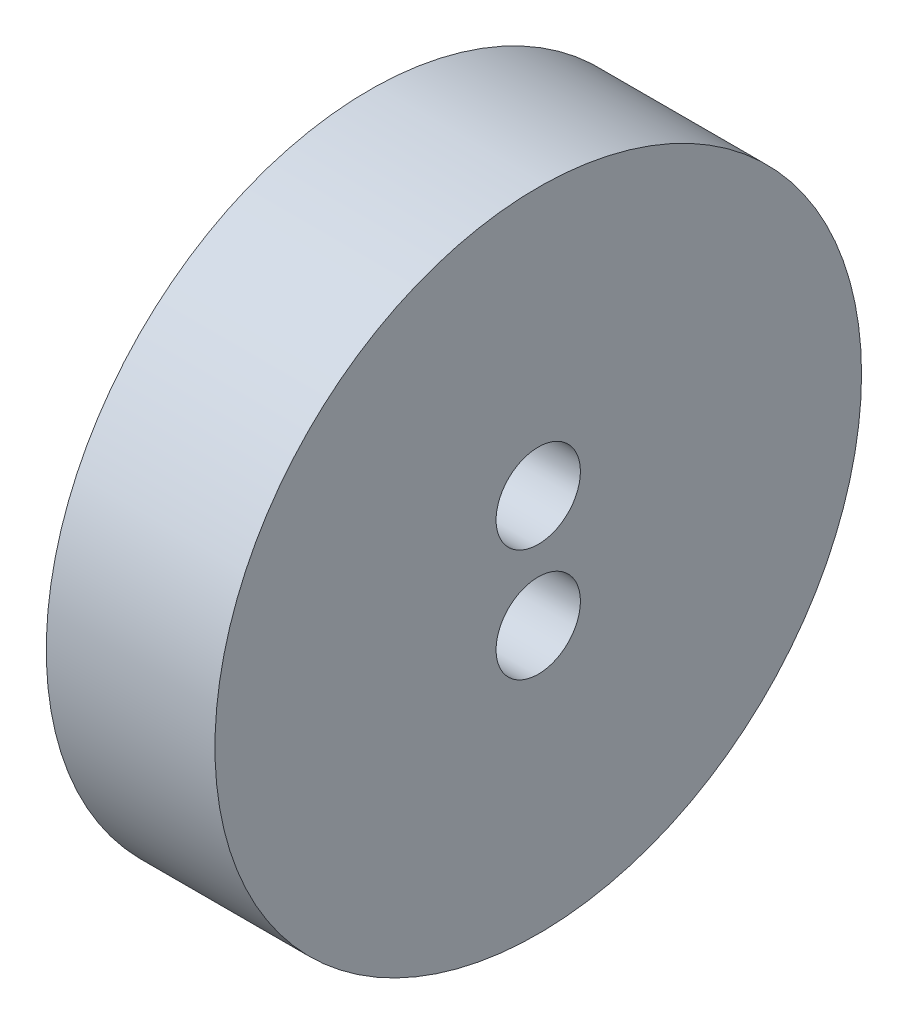
ISO-10303-21;
HEADER;
FILE_DESCRIPTION(('STEP AP214'),'2;1');
FILE_NAME('part.step','',(''),(''),'','','');
FILE_SCHEMA(('AUTOMOTIVE_DESIGN { 1 0 10303 214 1 1 1 1 }'));
ENDSEC;
DATA;
#1=APPLICATION_CONTEXT('core data for automotive mechanical design processes');
#2=APPLICATION_PROTOCOL_DEFINITION('international standard','automotive_design',2000,#1);
#3=PRODUCT_CONTEXT('',#1,'mechanical');
#4=PRODUCT('Part','Part','',(#3));
#5=PRODUCT_RELATED_PRODUCT_CATEGORY('part','',(#4));
#6=PRODUCT_DEFINITION_FORMATION('','',#4);
#7=PRODUCT_DEFINITION_CONTEXT('part definition',#1,'design');
#8=PRODUCT_DEFINITION('design','',#6,#7);
#9=PRODUCT_DEFINITION_SHAPE('','',#8);
#10=(LENGTH_UNIT() NAMED_UNIT(*) SI_UNIT(.MILLI.,.METRE.));
#11=(NAMED_UNIT(*) PLANE_ANGLE_UNIT() SI_UNIT($,.RADIAN.));
#12=(NAMED_UNIT(*) SI_UNIT($,.STERADIAN.) SOLID_ANGLE_UNIT());
#13=UNCERTAINTY_MEASURE_WITH_UNIT(LENGTH_MEASURE(1.E-05),#10,'distance_accuracy_value','');
#14=(GEOMETRIC_REPRESENTATION_CONTEXT(3) GLOBAL_UNCERTAINTY_ASSIGNED_CONTEXT((#13)) GLOBAL_UNIT_ASSIGNED_CONTEXT((#10,
#11,#12)) REPRESENTATION_CONTEXT('',''));
#15=CARTESIAN_POINT('',(0.,0.,0.));
#16=DIRECTION('',(0.,0.,1.));
#17=DIRECTION('',(1.,0.,0.));
#18=AXIS2_PLACEMENT_3D('',#15,#16,#17);
#19=CARTESIAN_POINT('',(6.,0.,0.));
#20=DIRECTION('',(1.,0.,0.));
#21=DIRECTION('',(0.,0.,-1.));
#22=AXIS2_PLACEMENT_3D('',#19,#20,#21);
#23=PLANE('',#22);
#24=CARTESIAN_POINT('',(6.,2.,0.));
#25=DIRECTION('',(1.,0.,0.));
#26=DIRECTION('',(0.,0.,-1.));
#27=AXIS2_PLACEMENT_3D('',#24,#25,#26);
#28=CIRCLE('',#27,1.5);
#29=CARTESIAN_POINT('',(6.,2.,-1.5));
#30=VERTEX_POINT('',#29);
#31=EDGE_CURVE('E48',#30,#30,#28,.T.);
#32=ORIENTED_EDGE('',*,*,#31,.F.);
#33=EDGE_LOOP('',(#32));
#34=FACE_BOUND('',#33,.T.);
#35=CARTESIAN_POINT('',(6.,0.,0.));
#36=DIRECTION('',(1.,0.,0.));
#37=DIRECTION('',(0.,0.,-1.));
#38=AXIS2_PLACEMENT_3D('',#35,#36,#37);
#39=CIRCLE('',#38,11.5);
#40=CARTESIAN_POINT('',(6.,0.,-11.5));
#41=VERTEX_POINT('',#40);
#42=EDGE_CURVE('E11',#41,#41,#39,.T.);
#43=ORIENTED_EDGE('',*,*,#42,.T.);
#44=EDGE_LOOP('',(#43));
#45=FACE_BOUND('',#44,.T.);
#46=CARTESIAN_POINT('',(6.,-2.,0.));
#47=DIRECTION('',(1.,0.,0.));
#48=DIRECTION('',(0.,0.,-1.));
#49=AXIS2_PLACEMENT_3D('',#46,#47,#48);
#50=CIRCLE('',#49,1.5);
#51=CARTESIAN_POINT('',(6.,-2.,-1.5));
#52=VERTEX_POINT('',#51);
#53=EDGE_CURVE('E59',#52,#52,#50,.T.);
#54=ORIENTED_EDGE('',*,*,#53,.F.);
#55=EDGE_LOOP('',(#54));
#56=FACE_BOUND('',#55,.T.);
#57=ADVANCED_FACE('F34',(#34,#45,#56),#23,.T.);
#58=CARTESIAN_POINT('',(0.,0.,0.));
#59=DIRECTION('',(1.,0.,0.));
#60=DIRECTION('',(0.,0.,-1.));
#61=AXIS2_PLACEMENT_3D('',#58,#59,#60);
#62=PLANE('',#61);
#63=CARTESIAN_POINT('',(0.,0.,0.));
#64=DIRECTION('',(1.,0.,0.));
#65=DIRECTION('',(0.,0.,-1.));
#66=AXIS2_PLACEMENT_3D('',#63,#64,#65);
#67=CIRCLE('',#66,11.5);
#68=CARTESIAN_POINT('',(0.,0.,-11.5));
#69=VERTEX_POINT('',#68);
#70=EDGE_CURVE('E38',#69,#69,#67,.T.);
#71=ORIENTED_EDGE('',*,*,#70,.F.);
#72=EDGE_LOOP('',(#71));
#73=FACE_BOUND('',#72,.T.);
#74=CARTESIAN_POINT('',(0.,2.,0.));
#75=DIRECTION('',(1.,0.,0.));
#76=DIRECTION('',(0.,0.,-1.));
#77=AXIS2_PLACEMENT_3D('',#74,#75,#76);
#78=CIRCLE('',#77,1.5);
#79=CARTESIAN_POINT('',(0.,2.,-1.5));
#80=VERTEX_POINT('',#79);
#81=EDGE_CURVE('E51',#80,#80,#78,.T.);
#82=ORIENTED_EDGE('',*,*,#81,.T.);
#83=EDGE_LOOP('',(#82));
#84=FACE_BOUND('',#83,.T.);
#85=CARTESIAN_POINT('',(0.,-2.,0.));
#86=DIRECTION('',(1.,0.,0.));
#87=DIRECTION('',(0.,0.,-1.));
#88=AXIS2_PLACEMENT_3D('',#85,#86,#87);
#89=CIRCLE('',#88,1.5);
#90=CARTESIAN_POINT('',(0.,-2.,-1.5));
#91=VERTEX_POINT('',#90);
#92=EDGE_CURVE('E57',#91,#91,#89,.T.);
#93=ORIENTED_EDGE('',*,*,#92,.T.);
#94=EDGE_LOOP('',(#93));
#95=FACE_BOUND('',#94,.T.);
#96=ADVANCED_FACE('F67',(#73,#84,#95),#62,.F.);
#97=CARTESIAN_POINT('',(6.,0.,0.));
#98=DIRECTION('',(-1.,0.,0.));
#99=DIRECTION('',(0.,0.,1.));
#100=AXIS2_PLACEMENT_3D('',#97,#98,#99);
#101=CYLINDRICAL_SURFACE('',#100,11.5);
#102=ORIENTED_EDGE('',*,*,#42,.F.);
#103=EDGE_LOOP('',(#102));
#104=FACE_BOUND('',#103,.T.);
#105=ORIENTED_EDGE('',*,*,#70,.T.);
#106=EDGE_LOOP('',(#105));
#107=FACE_BOUND('',#106,.T.);
#108=ADVANCED_FACE('F36',(#104,#107),#101,.T.);
#109=CARTESIAN_POINT('',(6.,2.,0.));
#110=DIRECTION('',(-1.,0.,0.));
#111=DIRECTION('',(0.,0.,1.));
#112=AXIS2_PLACEMENT_3D('',#109,#110,#111);
#113=CYLINDRICAL_SURFACE('',#112,1.5);
#114=ORIENTED_EDGE('',*,*,#31,.T.);
#115=EDGE_LOOP('',(#114));
#116=FACE_BOUND('',#115,.T.);
#117=ORIENTED_EDGE('',*,*,#81,.F.);
#118=EDGE_LOOP('',(#117));
#119=FACE_BOUND('',#118,.T.);
#120=ADVANCED_FACE('F70',(#116,#119),#113,.F.);
#121=CARTESIAN_POINT('',(6.,-2.,0.));
#122=DIRECTION('',(-1.,0.,0.));
#123=DIRECTION('',(0.,0.,1.));
#124=AXIS2_PLACEMENT_3D('',#121,#122,#123);
#125=CYLINDRICAL_SURFACE('',#124,1.5);
#126=ORIENTED_EDGE('',*,*,#53,.T.);
#127=EDGE_LOOP('',(#126));
#128=FACE_BOUND('',#127,.T.);
#129=ORIENTED_EDGE('',*,*,#92,.F.);
#130=EDGE_LOOP('',(#129));
#131=FACE_BOUND('',#130,.T.);
#132=ADVANCED_FACE('F72',(#128,#131),#125,.F.);
#133=CLOSED_SHELL('',(#57,#96,#108,#120,#132));
#134=MANIFOLD_SOLID_BREP('B2',#133);
#135=ADVANCED_BREP_SHAPE_REPRESENTATION('',(#18,#134),#14);
#136=SHAPE_DEFINITION_REPRESENTATION(#9,#135);
ENDSEC;
END-ISO-10303-21;
